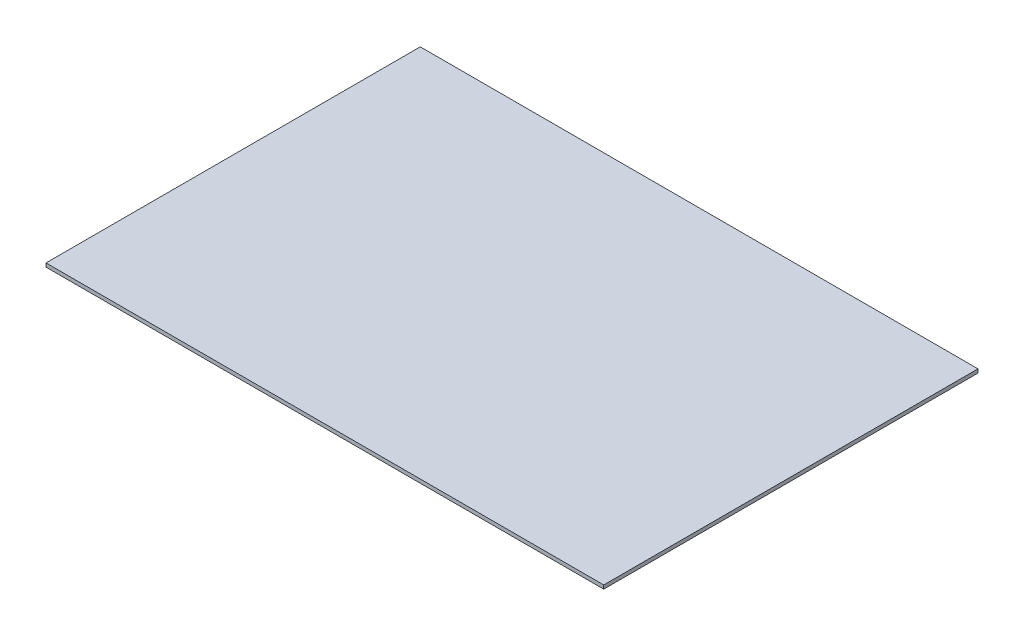
ISO-10303-21;
HEADER;
FILE_DESCRIPTION(('STEP AP214'),'2;1');
FILE_NAME('part.step','',(''),(''),'','','');
FILE_SCHEMA(('AUTOMOTIVE_DESIGN { 1 0 10303 214 1 1 1 1 }'));
ENDSEC;
DATA;
#1=APPLICATION_CONTEXT('core data for automotive mechanical design processes');
#2=APPLICATION_PROTOCOL_DEFINITION('international standard','automotive_design',2000,#1);
#3=PRODUCT_CONTEXT('',#1,'mechanical');
#4=PRODUCT('Part','Part','',(#3));
#5=PRODUCT_RELATED_PRODUCT_CATEGORY('part','',(#4));
#6=PRODUCT_DEFINITION_FORMATION('','',#4);
#7=PRODUCT_DEFINITION_CONTEXT('part definition',#1,'design');
#8=PRODUCT_DEFINITION('design','',#6,#7);
#9=PRODUCT_DEFINITION_SHAPE('','',#8);
#10=(LENGTH_UNIT() NAMED_UNIT(*) SI_UNIT(.MILLI.,.METRE.));
#11=(NAMED_UNIT(*) PLANE_ANGLE_UNIT() SI_UNIT($,.RADIAN.));
#12=(NAMED_UNIT(*) SI_UNIT($,.STERADIAN.) SOLID_ANGLE_UNIT());
#13=UNCERTAINTY_MEASURE_WITH_UNIT(LENGTH_MEASURE(1.E-05),#10,'distance_accuracy_value','');
#14=(GEOMETRIC_REPRESENTATION_CONTEXT(3) GLOBAL_UNCERTAINTY_ASSIGNED_CONTEXT((#13)) GLOBAL_UNIT_ASSIGNED_CONTEXT((#10,
#11,#12)) REPRESENTATION_CONTEXT('',''));
#15=CARTESIAN_POINT('',(0.,0.,0.));
#16=DIRECTION('',(0.,0.,1.));
#17=DIRECTION('',(1.,0.,0.));
#18=AXIS2_PLACEMENT_3D('',#15,#16,#17);
#19=CARTESIAN_POINT('',(0.,3.175,0.));
#20=DIRECTION('',(1.,0.,0.));
#21=DIRECTION('',(0.,0.,-1.));
#22=AXIS2_PLACEMENT_3D('',#19,#20,#21);
#23=PLANE('',#22);
#24=DIRECTION('',(0.,0.,1.));
#25=VECTOR('',#24,1.);
#26=CARTESIAN_POINT('',(0.,0.,0.));
#27=LINE('',#26,#25);
#28=CARTESIAN_POINT('',(0.,0.,-323.85));
#29=VERTEX_POINT('',#28);
#30=CARTESIAN_POINT('',(0.,0.,0.));
#31=VERTEX_POINT('',#30);
#32=EDGE_CURVE('E96',#29,#31,#27,.T.);
#33=ORIENTED_EDGE('',*,*,#32,.T.);
#34=DIRECTION('',(0.,-1.,0.));
#35=VECTOR('',#34,1.);
#36=CARTESIAN_POINT('',(0.,3.175,0.));
#37=LINE('',#36,#35);
#38=CARTESIAN_POINT('',(0.,3.175,0.));
#39=VERTEX_POINT('',#38);
#40=EDGE_CURVE('E11',#39,#31,#37,.T.);
#41=ORIENTED_EDGE('',*,*,#40,.F.);
#42=DIRECTION('',(0.,0.,1.));
#43=VECTOR('',#42,1.);
#44=CARTESIAN_POINT('',(0.,3.175,0.));
#45=LINE('',#44,#43);
#46=CARTESIAN_POINT('',(0.,3.175,-323.85));
#47=VERTEX_POINT('',#46);
#48=EDGE_CURVE('E84',#47,#39,#45,.T.);
#49=ORIENTED_EDGE('',*,*,#48,.F.);
#50=DIRECTION('',(0.,-1.,0.));
#51=VECTOR('',#50,1.);
#52=CARTESIAN_POINT('',(0.,3.175,-323.85));
#53=LINE('',#52,#51);
#54=EDGE_CURVE('E92',#47,#29,#53,.T.);
#55=ORIENTED_EDGE('',*,*,#54,.T.);
#56=EDGE_LOOP('',(#33,#41,#49,#55));
#57=FACE_BOUND('',#56,.T.);
#58=ADVANCED_FACE('F33',(#57),#23,.F.);
#59=CARTESIAN_POINT('',(0.,3.175,0.));
#60=DIRECTION('',(0.,0.,-1.));
#61=DIRECTION('',(-1.,0.,0.));
#62=AXIS2_PLACEMENT_3D('',#59,#60,#61);
#63=PLANE('',#62);
#64=DIRECTION('',(1.,0.,0.));
#65=VECTOR('',#64,1.);
#66=CARTESIAN_POINT('',(0.,0.,0.));
#67=LINE('',#66,#65);
#68=CARTESIAN_POINT('',(482.6,0.,0.));
#69=VERTEX_POINT('',#68);
#70=EDGE_CURVE('E88',#31,#69,#67,.T.);
#71=ORIENTED_EDGE('',*,*,#70,.T.);
#72=DIRECTION('',(0.,-1.,0.));
#73=VECTOR('',#72,1.);
#74=CARTESIAN_POINT('',(482.6,3.175,0.));
#75=LINE('',#74,#73);
#76=CARTESIAN_POINT('',(482.6,3.175,0.));
#77=VERTEX_POINT('',#76);
#78=EDGE_CURVE('E41',#77,#69,#75,.T.);
#79=ORIENTED_EDGE('',*,*,#78,.F.);
#80=DIRECTION('',(1.,0.,0.));
#81=VECTOR('',#80,1.);
#82=CARTESIAN_POINT('',(0.,3.175,0.));
#83=LINE('',#82,#81);
#84=EDGE_CURVE('E79',#39,#77,#83,.T.);
#85=ORIENTED_EDGE('',*,*,#84,.F.);
#86=ORIENTED_EDGE('',*,*,#40,.T.);
#87=EDGE_LOOP('',(#71,#79,#85,#86));
#88=FACE_BOUND('',#87,.T.);
#89=ADVANCED_FACE('F87',(#88),#63,.F.);
#90=CARTESIAN_POINT('',(482.6,3.175,0.));
#91=DIRECTION('',(-1.,0.,0.));
#92=DIRECTION('',(0.,0.,1.));
#93=AXIS2_PLACEMENT_3D('',#90,#91,#92);
#94=PLANE('',#93);
#95=DIRECTION('',(0.,0.,-1.));
#96=VECTOR('',#95,1.);
#97=CARTESIAN_POINT('',(482.6,0.,0.));
#98=LINE('',#97,#96);
#99=CARTESIAN_POINT('',(482.6,0.,-323.85));
#100=VERTEX_POINT('',#99);
#101=EDGE_CURVE('E66',#69,#100,#98,.T.);
#102=ORIENTED_EDGE('',*,*,#101,.T.);
#103=DIRECTION('',(0.,-1.,0.));
#104=VECTOR('',#103,1.);
#105=CARTESIAN_POINT('',(482.6,3.175,-323.85));
#106=LINE('',#105,#104);
#107=CARTESIAN_POINT('',(482.6,3.175,-323.85));
#108=VERTEX_POINT('',#107);
#109=EDGE_CURVE('E89',#108,#100,#106,.T.);
#110=ORIENTED_EDGE('',*,*,#109,.F.);
#111=DIRECTION('',(0.,0.,-1.));
#112=VECTOR('',#111,1.);
#113=CARTESIAN_POINT('',(482.6,3.175,0.));
#114=LINE('',#113,#112);
#115=EDGE_CURVE('E82',#77,#108,#114,.T.);
#116=ORIENTED_EDGE('',*,*,#115,.F.);
#117=ORIENTED_EDGE('',*,*,#78,.T.);
#118=EDGE_LOOP('',(#102,#110,#116,#117));
#119=FACE_BOUND('',#118,.T.);
#120=ADVANCED_FACE('F90',(#119),#94,.F.);
#121=CARTESIAN_POINT('',(0.,3.175,-323.85));
#122=DIRECTION('',(0.,0.,1.));
#123=DIRECTION('',(1.,0.,0.));
#124=AXIS2_PLACEMENT_3D('',#121,#122,#123);
#125=PLANE('',#124);
#126=DIRECTION('',(-1.,0.,0.));
#127=VECTOR('',#126,1.);
#128=CARTESIAN_POINT('',(0.,0.,-323.85));
#129=LINE('',#128,#127);
#130=EDGE_CURVE('E72',#100,#29,#129,.T.);
#131=ORIENTED_EDGE('',*,*,#130,.T.);
#132=ORIENTED_EDGE('',*,*,#54,.F.);
#133=DIRECTION('',(-1.,0.,0.));
#134=VECTOR('',#133,1.);
#135=CARTESIAN_POINT('',(0.,3.175,-323.85));
#136=LINE('',#135,#134);
#137=EDGE_CURVE('E49',#108,#47,#136,.T.);
#138=ORIENTED_EDGE('',*,*,#137,.F.);
#139=ORIENTED_EDGE('',*,*,#109,.T.);
#140=EDGE_LOOP('',(#131,#132,#138,#139));
#141=FACE_BOUND('',#140,.T.);
#142=ADVANCED_FACE('F103',(#141),#125,.F.);
#143=CARTESIAN_POINT('',(0.,3.175,0.));
#144=DIRECTION('',(0.,-1.,0.));
#145=DIRECTION('',(0.,0.,-1.));
#146=AXIS2_PLACEMENT_3D('',#143,#144,#145);
#147=PLANE('',#146);
#148=ORIENTED_EDGE('',*,*,#48,.T.);
#149=ORIENTED_EDGE('',*,*,#84,.T.);
#150=ORIENTED_EDGE('',*,*,#115,.T.);
#151=ORIENTED_EDGE('',*,*,#137,.T.);
#152=EDGE_LOOP('',(#148,#149,#150,#151));
#153=FACE_BOUND('',#152,.T.);
#154=ADVANCED_FACE('F80',(#153),#147,.F.);
#155=CARTESIAN_POINT('',(0.,0.,0.));
#156=DIRECTION('',(0.,-1.,0.));
#157=DIRECTION('',(0.,0.,-1.));
#158=AXIS2_PLACEMENT_3D('',#155,#156,#157);
#159=PLANE('',#158);
#160=ORIENTED_EDGE('',*,*,#32,.F.);
#161=ORIENTED_EDGE('',*,*,#130,.F.);
#162=ORIENTED_EDGE('',*,*,#101,.F.);
#163=ORIENTED_EDGE('',*,*,#70,.F.);
#164=EDGE_LOOP('',(#160,#161,#162,#163));
#165=FACE_BOUND('',#164,.T.);
#166=ADVANCED_FACE('F106',(#165),#159,.T.);
#167=CLOSED_SHELL('',(#58,#89,#120,#142,#154,#166));
#168=MANIFOLD_SOLID_BREP('B2',#167);
#169=ADVANCED_BREP_SHAPE_REPRESENTATION('',(#18,#168),#14);
#170=SHAPE_DEFINITION_REPRESENTATION(#9,#169);
ENDSEC;
END-ISO-10303-21;
